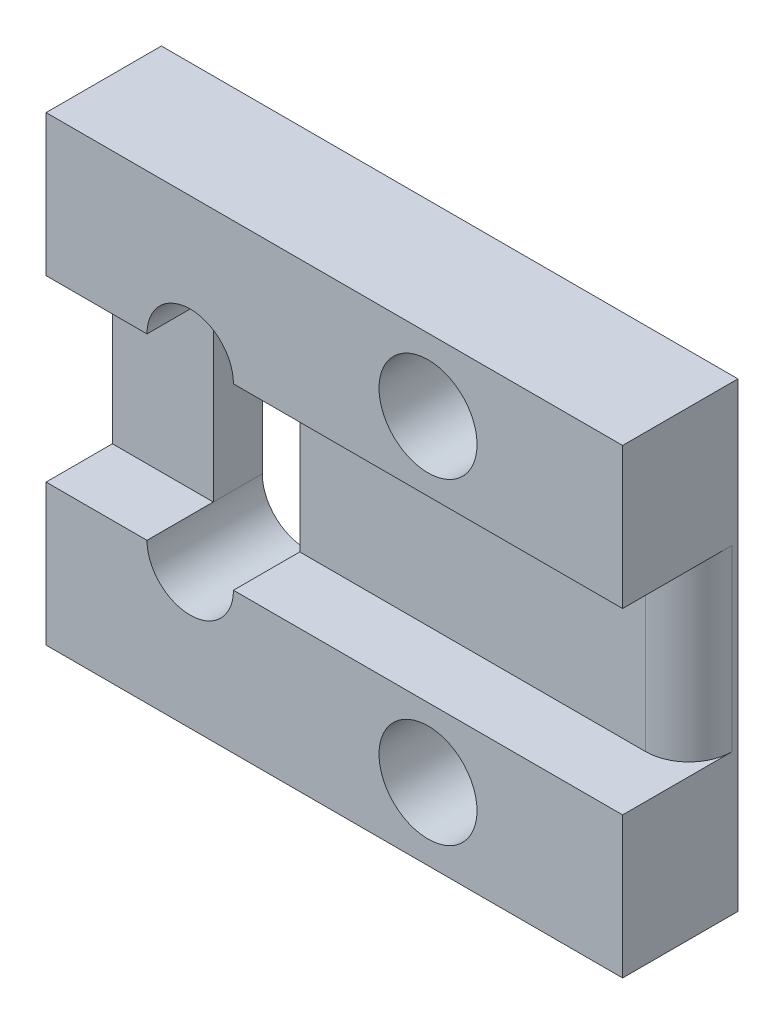
ISO-10303-21;
HEADER;
FILE_DESCRIPTION(('STEP AP214'),'2;1');
FILE_NAME('part.step','',(''),(''),'','','');
FILE_SCHEMA(('AUTOMOTIVE_DESIGN { 1 0 10303 214 1 1 1 1 }'));
ENDSEC;
DATA;
#1=APPLICATION_CONTEXT('core data for automotive mechanical design processes');
#2=APPLICATION_PROTOCOL_DEFINITION('international standard','automotive_design',2000,#1);
#3=PRODUCT_CONTEXT('',#1,'mechanical');
#4=PRODUCT('Part','Part','',(#3));
#5=PRODUCT_RELATED_PRODUCT_CATEGORY('part','',(#4));
#6=PRODUCT_DEFINITION_FORMATION('','',#4);
#7=PRODUCT_DEFINITION_CONTEXT('part definition',#1,'design');
#8=PRODUCT_DEFINITION('design','',#6,#7);
#9=PRODUCT_DEFINITION_SHAPE('','',#8);
#10=(LENGTH_UNIT() NAMED_UNIT(*) SI_UNIT(.MILLI.,.METRE.));
#11=(NAMED_UNIT(*) PLANE_ANGLE_UNIT() SI_UNIT($,.RADIAN.));
#12=(NAMED_UNIT(*) SI_UNIT($,.STERADIAN.) SOLID_ANGLE_UNIT());
#13=UNCERTAINTY_MEASURE_WITH_UNIT(LENGTH_MEASURE(1.E-05),#10,'distance_accuracy_value','');
#14=(GEOMETRIC_REPRESENTATION_CONTEXT(3) GLOBAL_UNCERTAINTY_ASSIGNED_CONTEXT((#13)) GLOBAL_UNIT_ASSIGNED_CONTEXT((#10,
#11,#12)) REPRESENTATION_CONTEXT('',''));
#15=CARTESIAN_POINT('',(0.,0.,0.));
#16=DIRECTION('',(0.,0.,1.));
#17=DIRECTION('',(1.,0.,0.));
#18=AXIS2_PLACEMENT_3D('',#15,#16,#17);
#19=CARTESIAN_POINT('',(0.,16.,4.));
#20=DIRECTION('',(0.,0.,-1.));
#21=DIRECTION('',(-1.,0.,0.));
#22=AXIS2_PLACEMENT_3D('',#19,#20,#21);
#23=PLANE('',#22);
#24=CARTESIAN_POINT('',(13.25,13.5,4.));
#25=DIRECTION('',(0.,0.,1.));
#26=DIRECTION('',(1.,0.,0.));
#27=AXIS2_PLACEMENT_3D('',#24,#25,#26);
#28=CIRCLE('',#27,1.7);
#29=CARTESIAN_POINT('',(14.95,13.5,4.));
#30=VERTEX_POINT('',#29);
#31=EDGE_CURVE('E257',#30,#30,#28,.T.);
#32=ORIENTED_EDGE('',*,*,#31,.F.);
#33=EDGE_LOOP('',(#32));
#34=FACE_BOUND('',#33,.T.);
#35=DIRECTION('',(0.,-1.,0.));
#36=VECTOR('',#35,1.);
#37=CARTESIAN_POINT('',(0.,0.,4.));
#38=LINE('',#37,#36);
#39=CARTESIAN_POINT('',(0.,16.,4.));
#40=VERTEX_POINT('',#39);
#41=CARTESIAN_POINT('',(0.,11.1,4.));
#42=VERTEX_POINT('',#41);
#43=EDGE_CURVE('E168',#40,#42,#38,.T.);
#44=ORIENTED_EDGE('',*,*,#43,.T.);
#45=DIRECTION('',(-1.,0.,0.));
#46=VECTOR('',#45,1.);
#47=CARTESIAN_POINT('',(-1.27364380183259,11.1,4.));
#48=LINE('',#47,#46);
#49=CARTESIAN_POINT('',(3.5,11.1,4.));
#50=VERTEX_POINT('',#49);
#51=EDGE_CURVE('E160',#50,#42,#48,.T.);
#52=ORIENTED_EDGE('',*,*,#51,.F.);
#53=CARTESIAN_POINT('',(5.,11.1,4.));
#54=DIRECTION('',(0.,0.,1.));
#55=DIRECTION('',(1.,0.,0.));
#56=AXIS2_PLACEMENT_3D('',#53,#54,#55);
#57=CIRCLE('',#56,1.5);
#58=CARTESIAN_POINT('',(6.5,11.1,4.));
#59=VERTEX_POINT('',#58);
#60=EDGE_CURVE('E243',#59,#50,#57,.T.);
#61=ORIENTED_EDGE('',*,*,#60,.F.);
#62=CARTESIAN_POINT('',(20.,11.1,4.));
#63=VERTEX_POINT('',#62);
#64=EDGE_CURVE('E242',#63,#59,#48,.T.);
#65=ORIENTED_EDGE('',*,*,#64,.F.);
#66=DIRECTION('',(0.,1.,0.));
#67=VECTOR('',#66,1.);
#68=CARTESIAN_POINT('',(20.,0.,4.));
#69=LINE('',#68,#67);
#70=CARTESIAN_POINT('',(20.,16.,4.));
#71=VERTEX_POINT('',#70);
#72=EDGE_CURVE('E180',#63,#71,#69,.T.);
#73=ORIENTED_EDGE('',*,*,#72,.T.);
#74=DIRECTION('',(-1.,0.,0.));
#75=VECTOR('',#74,1.);
#76=CARTESIAN_POINT('',(0.,16.,4.));
#77=LINE('',#76,#75);
#78=EDGE_CURVE('E183',#71,#40,#77,.T.);
#79=ORIENTED_EDGE('',*,*,#78,.T.);
#80=EDGE_LOOP('',(#44,#52,#61,#65,#73,#79));
#81=FACE_BOUND('',#80,.T.);
#82=ADVANCED_FACE('F33',(#34,#81),#23,.F.);
#83=CARTESIAN_POINT('',(3.5,11.1,4.));
#84=DIRECTION('',(1.,0.,0.));
#85=DIRECTION('',(0.,1.,0.));
#86=AXIS2_PLACEMENT_3D('',#83,#84,#85);
#87=PLANE('',#86);
#88=DIRECTION('',(0.,0.,-1.));
#89=VECTOR('',#88,1.);
#90=CARTESIAN_POINT('',(3.5,11.1,4.));
#91=LINE('',#90,#89);
#92=CARTESIAN_POINT('',(3.5,11.1,1.7));
#93=VERTEX_POINT('',#92);
#94=CARTESIAN_POINT('',(3.5,11.1,0.));
#95=VERTEX_POINT('',#94);
#96=EDGE_CURVE('E291',#93,#95,#91,.T.);
#97=ORIENTED_EDGE('',*,*,#96,.F.);
#98=DIRECTION('',(0.,-1.,0.));
#99=VECTOR('',#98,1.);
#100=CARTESIAN_POINT('',(3.5,11.1,1.7));
#101=LINE('',#100,#99);
#102=CARTESIAN_POINT('',(3.5,4.9,1.7));
#103=VERTEX_POINT('',#102);
#104=EDGE_CURVE('E251',#93,#103,#101,.T.);
#105=ORIENTED_EDGE('',*,*,#104,.T.);
#106=DIRECTION('',(0.,0.,-1.));
#107=VECTOR('',#106,1.);
#108=CARTESIAN_POINT('',(3.5,4.9,4.));
#109=LINE('',#108,#107);
#110=CARTESIAN_POINT('',(3.5,4.9,0.));
#111=VERTEX_POINT('',#110);
#112=EDGE_CURVE('E289',#103,#111,#109,.T.);
#113=ORIENTED_EDGE('',*,*,#112,.T.);
#114=DIRECTION('',(0.,-1.,0.));
#115=VECTOR('',#114,1.);
#116=CARTESIAN_POINT('',(3.5,11.1,0.));
#117=LINE('',#116,#115);
#118=EDGE_CURVE('E276',#95,#111,#117,.T.);
#119=ORIENTED_EDGE('',*,*,#118,.F.);
#120=EDGE_LOOP('',(#97,#105,#113,#119));
#121=FACE_BOUND('',#120,.T.);
#122=ADVANCED_FACE('F297',(#121),#87,.T.);
#123=CARTESIAN_POINT('',(6.5,11.1,4.));
#124=DIRECTION('',(-1.,0.,0.));
#125=DIRECTION('',(0.,-1.,0.));
#126=AXIS2_PLACEMENT_3D('',#123,#124,#125);
#127=PLANE('',#126);
#128=DIRECTION('',(0.,0.,-1.));
#129=VECTOR('',#128,1.);
#130=CARTESIAN_POINT('',(6.5,4.9,4.));
#131=LINE('',#130,#129);
#132=CARTESIAN_POINT('',(6.5,4.9,1.7));
#133=VERTEX_POINT('',#132);
#134=CARTESIAN_POINT('',(6.5,4.9,0.));
#135=VERTEX_POINT('',#134);
#136=EDGE_CURVE('E286',#133,#135,#131,.T.);
#137=ORIENTED_EDGE('',*,*,#136,.F.);
#138=DIRECTION('',(0.,1.,0.));
#139=VECTOR('',#138,1.);
#140=CARTESIAN_POINT('',(6.5,11.1,1.7));
#141=LINE('',#140,#139);
#142=CARTESIAN_POINT('',(6.5,11.1,1.7));
#143=VERTEX_POINT('',#142);
#144=EDGE_CURVE('E200',#133,#143,#141,.T.);
#145=ORIENTED_EDGE('',*,*,#144,.T.);
#146=DIRECTION('',(0.,0.,-1.));
#147=VECTOR('',#146,1.);
#148=CARTESIAN_POINT('',(6.5,11.1,4.));
#149=LINE('',#148,#147);
#150=CARTESIAN_POINT('',(6.5,11.1,0.));
#151=VERTEX_POINT('',#150);
#152=EDGE_CURVE('E273',#143,#151,#149,.T.);
#153=ORIENTED_EDGE('',*,*,#152,.T.);
#154=DIRECTION('',(0.,1.,0.));
#155=VECTOR('',#154,1.);
#156=CARTESIAN_POINT('',(6.5,11.1,0.));
#157=LINE('',#156,#155);
#158=EDGE_CURVE('E271',#135,#151,#157,.T.);
#159=ORIENTED_EDGE('',*,*,#158,.F.);
#160=EDGE_LOOP('',(#137,#145,#153,#159));
#161=FACE_BOUND('',#160,.T.);
#162=ADVANCED_FACE('F334',(#161),#127,.T.);
#163=CARTESIAN_POINT('',(0.,16.,0.));
#164=DIRECTION('',(0.,0.,-1.));
#165=DIRECTION('',(-1.,0.,0.));
#166=AXIS2_PLACEMENT_3D('',#163,#164,#165);
#167=PLANE('',#166);
#168=CARTESIAN_POINT('',(13.25,2.5,0.));
#169=DIRECTION('',(0.,0.,1.));
#170=DIRECTION('',(1.,0.,0.));
#171=AXIS2_PLACEMENT_3D('',#168,#169,#170);
#172=CIRCLE('',#171,1.7);
#173=CARTESIAN_POINT('',(14.95,2.5,0.));
#174=VERTEX_POINT('',#173);
#175=EDGE_CURVE('E266',#174,#174,#172,.T.);
#176=ORIENTED_EDGE('',*,*,#175,.T.);
#177=EDGE_LOOP('',(#176));
#178=FACE_BOUND('',#177,.T.);
#179=DIRECTION('',(0.,-1.,0.));
#180=VECTOR('',#179,1.);
#181=CARTESIAN_POINT('',(0.,0.,0.));
#182=LINE('',#181,#180);
#183=CARTESIAN_POINT('',(0.,16.,0.));
#184=VERTEX_POINT('',#183);
#185=CARTESIAN_POINT('',(0.,0.,0.));
#186=VERTEX_POINT('',#185);
#187=EDGE_CURVE('E186',#184,#186,#182,.T.);
#188=ORIENTED_EDGE('',*,*,#187,.F.);
#189=DIRECTION('',(-1.,0.,0.));
#190=VECTOR('',#189,1.);
#191=CARTESIAN_POINT('',(0.,16.,0.));
#192=LINE('',#191,#190);
#193=CARTESIAN_POINT('',(20.,16.,0.));
#194=VERTEX_POINT('',#193);
#195=EDGE_CURVE('E169',#194,#184,#192,.T.);
#196=ORIENTED_EDGE('',*,*,#195,.F.);
#197=DIRECTION('',(0.,1.,0.));
#198=VECTOR('',#197,1.);
#199=CARTESIAN_POINT('',(20.,0.,0.));
#200=LINE('',#199,#198);
#201=CARTESIAN_POINT('',(20.,0.,0.));
#202=VERTEX_POINT('',#201);
#203=EDGE_CURVE('E173',#202,#194,#200,.T.);
#204=ORIENTED_EDGE('',*,*,#203,.F.);
#205=DIRECTION('',(1.,0.,0.));
#206=VECTOR('',#205,1.);
#207=CARTESIAN_POINT('',(0.,0.,0.));
#208=LINE('',#207,#206);
#209=EDGE_CURVE('E188',#186,#202,#208,.T.);
#210=ORIENTED_EDGE('',*,*,#209,.F.);
#211=EDGE_LOOP('',(#188,#196,#204,#210));
#212=FACE_BOUND('',#211,.T.);
#213=ORIENTED_EDGE('',*,*,#158,.T.);
#214=CARTESIAN_POINT('',(5.,11.1,0.));
#215=DIRECTION('',(0.,0.,1.));
#216=DIRECTION('',(1.,0.,0.));
#217=AXIS2_PLACEMENT_3D('',#214,#215,#216);
#218=CIRCLE('',#217,1.5);
#219=EDGE_CURVE('E269',#151,#95,#218,.T.);
#220=ORIENTED_EDGE('',*,*,#219,.T.);
#221=ORIENTED_EDGE('',*,*,#118,.T.);
#222=CARTESIAN_POINT('',(5.,4.9,0.));
#223=DIRECTION('',(0.,0.,1.));
#224=DIRECTION('',(1.,0.,0.));
#225=AXIS2_PLACEMENT_3D('',#222,#223,#224);
#226=CIRCLE('',#225,1.5);
#227=EDGE_CURVE('E279',#111,#135,#226,.T.);
#228=ORIENTED_EDGE('',*,*,#227,.T.);
#229=EDGE_LOOP('',(#213,#220,#221,#228));
#230=FACE_BOUND('',#229,.T.);
#231=CARTESIAN_POINT('',(13.25,13.5,0.));
#232=DIRECTION('',(0.,0.,1.));
#233=DIRECTION('',(1.,0.,0.));
#234=AXIS2_PLACEMENT_3D('',#231,#232,#233);
#235=CIRCLE('',#234,1.7);
#236=CARTESIAN_POINT('',(14.95,13.5,0.));
#237=VERTEX_POINT('',#236);
#238=EDGE_CURVE('E260',#237,#237,#235,.T.);
#239=ORIENTED_EDGE('',*,*,#238,.T.);
#240=EDGE_LOOP('',(#239));
#241=FACE_BOUND('',#240,.T.);
#242=ADVANCED_FACE('F229',(#178,#212,#230,#241),#167,.T.);
#243=CARTESIAN_POINT('',(20.,0.,4.));
#244=VERTEX_POINT('',#243);
#245=CARTESIAN_POINT('',(20.,4.9,4.));
#246=VERTEX_POINT('',#245);
#247=EDGE_CURVE('E181',#244,#246,#69,.T.);
#248=ORIENTED_EDGE('',*,*,#247,.T.);
#249=DIRECTION('',(1.,0.,0.));
#250=VECTOR('',#249,1.);
#251=CARTESIAN_POINT('',(-1.27364380183259,4.9,4.));
#252=LINE('',#251,#250);
#253=CARTESIAN_POINT('',(6.5,4.9,4.));
#254=VERTEX_POINT('',#253);
#255=EDGE_CURVE('E161',#254,#246,#252,.T.);
#256=ORIENTED_EDGE('',*,*,#255,.F.);
#257=CARTESIAN_POINT('',(5.,4.9,4.));
#258=DIRECTION('',(0.,0.,1.));
#259=DIRECTION('',(1.,0.,0.));
#260=AXIS2_PLACEMENT_3D('',#257,#258,#259);
#261=CIRCLE('',#260,1.5);
#262=CARTESIAN_POINT('',(3.5,4.9,4.));
#263=VERTEX_POINT('',#262);
#264=EDGE_CURVE('E159',#263,#254,#261,.T.);
#265=ORIENTED_EDGE('',*,*,#264,.F.);
#266=CARTESIAN_POINT('',(0.,4.9,4.));
#267=VERTEX_POINT('',#266);
#268=EDGE_CURVE('E142',#267,#263,#252,.T.);
#269=ORIENTED_EDGE('',*,*,#268,.F.);
#270=CARTESIAN_POINT('',(0.,0.,4.));
#271=VERTEX_POINT('',#270);
#272=EDGE_CURVE('E155',#267,#271,#38,.T.);
#273=ORIENTED_EDGE('',*,*,#272,.T.);
#274=DIRECTION('',(1.,0.,0.));
#275=VECTOR('',#274,1.);
#276=CARTESIAN_POINT('',(0.,0.,4.));
#277=LINE('',#276,#275);
#278=EDGE_CURVE('E172',#271,#244,#277,.T.);
#279=ORIENTED_EDGE('',*,*,#278,.T.);
#280=EDGE_LOOP('',(#248,#256,#265,#269,#273,#279));
#281=FACE_BOUND('',#280,.T.);
#282=CARTESIAN_POINT('',(13.25,2.5,4.));
#283=DIRECTION('',(0.,0.,1.));
#284=DIRECTION('',(1.,0.,0.));
#285=AXIS2_PLACEMENT_3D('',#282,#283,#284);
#286=CIRCLE('',#285,1.7);
#287=CARTESIAN_POINT('',(14.95,2.5,4.));
#288=VERTEX_POINT('',#287);
#289=EDGE_CURVE('E263',#288,#288,#286,.T.);
#290=ORIENTED_EDGE('',*,*,#289,.F.);
#291=EDGE_LOOP('',(#290));
#292=FACE_BOUND('',#291,.T.);
#293=ADVANCED_FACE('F153',(#281,#292),#23,.F.);
#294=CARTESIAN_POINT('',(0.,0.,4.));
#295=DIRECTION('',(1.,0.,0.));
#296=DIRECTION('',(0.,1.,0.));
#297=AXIS2_PLACEMENT_3D('',#294,#295,#296);
#298=PLANE('',#297);
#299=DIRECTION('',(0.,-1.,0.));
#300=VECTOR('',#299,1.);
#301=CARTESIAN_POINT('',(0.,0.,1.7));
#302=LINE('',#301,#300);
#303=CARTESIAN_POINT('',(0.,11.1,1.7));
#304=VERTEX_POINT('',#303);
#305=CARTESIAN_POINT('',(0.,4.9,1.7));
#306=VERTEX_POINT('',#305);
#307=EDGE_CURVE('E219',#304,#306,#302,.T.);
#308=ORIENTED_EDGE('',*,*,#307,.F.);
#309=DIRECTION('',(0.,0.,1.));
#310=VECTOR('',#309,1.);
#311=CARTESIAN_POINT('',(0.,11.1,4.));
#312=LINE('',#311,#310);
#313=EDGE_CURVE('E237',#304,#42,#312,.T.);
#314=ORIENTED_EDGE('',*,*,#313,.T.);
#315=ORIENTED_EDGE('',*,*,#43,.F.);
#316=DIRECTION('',(0.,0.,-1.));
#317=VECTOR('',#316,1.);
#318=CARTESIAN_POINT('',(0.,16.,4.));
#319=LINE('',#318,#317);
#320=EDGE_CURVE('E185',#40,#184,#319,.T.);
#321=ORIENTED_EDGE('',*,*,#320,.T.);
#322=ORIENTED_EDGE('',*,*,#187,.T.);
#323=DIRECTION('',(0.,0.,-1.));
#324=VECTOR('',#323,1.);
#325=CARTESIAN_POINT('',(0.,0.,4.));
#326=LINE('',#325,#324);
#327=EDGE_CURVE('E167',#271,#186,#326,.T.);
#328=ORIENTED_EDGE('',*,*,#327,.F.);
#329=ORIENTED_EDGE('',*,*,#272,.F.);
#330=DIRECTION('',(0.,0.,-1.));
#331=VECTOR('',#330,1.);
#332=CARTESIAN_POINT('',(0.,4.9,4.));
#333=LINE('',#332,#331);
#334=EDGE_CURVE('E139',#267,#306,#333,.T.);
#335=ORIENTED_EDGE('',*,*,#334,.T.);
#336=EDGE_LOOP('',(#308,#314,#315,#321,#322,#328,#329,#335));
#337=FACE_BOUND('',#336,.T.);
#338=ADVANCED_FACE('F164',(#337),#298,.F.);
#339=CARTESIAN_POINT('',(0.,0.,4.));
#340=DIRECTION('',(0.,1.,0.));
#341=DIRECTION('',(-1.,0.,0.));
#342=AXIS2_PLACEMENT_3D('',#339,#340,#341);
#343=PLANE('',#342);
#344=ORIENTED_EDGE('',*,*,#209,.T.);
#345=DIRECTION('',(0.,0.,-1.));
#346=VECTOR('',#345,1.);
#347=CARTESIAN_POINT('',(20.,0.,4.));
#348=LINE('',#347,#346);
#349=EDGE_CURVE('E196',#244,#202,#348,.T.);
#350=ORIENTED_EDGE('',*,*,#349,.F.);
#351=ORIENTED_EDGE('',*,*,#278,.F.);
#352=ORIENTED_EDGE('',*,*,#327,.T.);
#353=EDGE_LOOP('',(#344,#350,#351,#352));
#354=FACE_BOUND('',#353,.T.);
#355=ADVANCED_FACE('F223',(#354),#343,.F.);
#356=CARTESIAN_POINT('',(20.,0.,4.));
#357=DIRECTION('',(-1.,0.,0.));
#358=DIRECTION('',(0.,-1.,0.));
#359=AXIS2_PLACEMENT_3D('',#356,#357,#358);
#360=PLANE('',#359);
#361=DIRECTION('',(0.,0.,-1.));
#362=VECTOR('',#361,1.);
#363=CARTESIAN_POINT('',(20.,11.1,4.));
#364=LINE('',#363,#362);
#365=CARTESIAN_POINT('',(20.,11.1,0.2));
#366=VERTEX_POINT('',#365);
#367=EDGE_CURVE('E48',#63,#366,#364,.T.);
#368=ORIENTED_EDGE('',*,*,#367,.T.);
#369=DIRECTION('',(0.,1.,0.));
#370=VECTOR('',#369,1.);
#371=CARTESIAN_POINT('',(20.,4.9,0.2));
#372=LINE('',#371,#370);
#373=CARTESIAN_POINT('',(20.,4.9,0.2));
#374=VERTEX_POINT('',#373);
#375=EDGE_CURVE('E206',#366,#374,#372,.F.);
#376=ORIENTED_EDGE('',*,*,#375,.T.);
#377=DIRECTION('',(0.,0.,1.));
#378=VECTOR('',#377,1.);
#379=CARTESIAN_POINT('',(20.,4.9,4.));
#380=LINE('',#379,#378);
#381=EDGE_CURVE('E55',#374,#246,#380,.T.);
#382=ORIENTED_EDGE('',*,*,#381,.T.);
#383=ORIENTED_EDGE('',*,*,#247,.F.);
#384=ORIENTED_EDGE('',*,*,#349,.T.);
#385=ORIENTED_EDGE('',*,*,#203,.T.);
#386=DIRECTION('',(0.,0.,-1.));
#387=VECTOR('',#386,1.);
#388=CARTESIAN_POINT('',(20.,16.,4.));
#389=LINE('',#388,#387);
#390=EDGE_CURVE('E193',#71,#194,#389,.T.);
#391=ORIENTED_EDGE('',*,*,#390,.F.);
#392=ORIENTED_EDGE('',*,*,#72,.F.);
#393=EDGE_LOOP('',(#368,#376,#382,#383,#384,#385,#391,#392));
#394=FACE_BOUND('',#393,.T.);
#395=ADVANCED_FACE('F217',(#394),#360,.F.);
#396=CARTESIAN_POINT('',(0.,16.,4.));
#397=DIRECTION('',(0.,-1.,0.));
#398=DIRECTION('',(1.,0.,0.));
#399=AXIS2_PLACEMENT_3D('',#396,#397,#398);
#400=PLANE('',#399);
#401=ORIENTED_EDGE('',*,*,#195,.T.);
#402=ORIENTED_EDGE('',*,*,#320,.F.);
#403=ORIENTED_EDGE('',*,*,#78,.F.);
#404=ORIENTED_EDGE('',*,*,#390,.T.);
#405=EDGE_LOOP('',(#401,#402,#403,#404));
#406=FACE_BOUND('',#405,.T.);
#407=ADVANCED_FACE('F233',(#406),#400,.F.);
#408=CARTESIAN_POINT('',(5.,11.1,4.));
#409=DIRECTION('',(0.,0.,-1.));
#410=DIRECTION('',(-1.,0.,0.));
#411=AXIS2_PLACEMENT_3D('',#408,#409,#410);
#412=CYLINDRICAL_SURFACE('',#411,1.5);
#413=ORIENTED_EDGE('',*,*,#219,.F.);
#414=ORIENTED_EDGE('',*,*,#152,.F.);
#415=EDGE_CURVE('E284',#59,#143,#149,.T.);
#416=ORIENTED_EDGE('',*,*,#415,.F.);
#417=ORIENTED_EDGE('',*,*,#60,.T.);
#418=EDGE_CURVE('E177',#50,#93,#91,.T.);
#419=ORIENTED_EDGE('',*,*,#418,.T.);
#420=ORIENTED_EDGE('',*,*,#96,.T.);
#421=EDGE_LOOP('',(#413,#414,#416,#417,#419,#420));
#422=FACE_BOUND('',#421,.T.);
#423=ADVANCED_FACE('F306',(#422),#412,.F.);
#424=CARTESIAN_POINT('',(5.,4.9,4.));
#425=DIRECTION('',(0.,0.,-1.));
#426=DIRECTION('',(-1.,0.,0.));
#427=AXIS2_PLACEMENT_3D('',#424,#425,#426);
#428=CYLINDRICAL_SURFACE('',#427,1.5);
#429=ORIENTED_EDGE('',*,*,#227,.F.);
#430=ORIENTED_EDGE('',*,*,#112,.F.);
#431=EDGE_CURVE('E290',#263,#103,#109,.T.);
#432=ORIENTED_EDGE('',*,*,#431,.F.);
#433=ORIENTED_EDGE('',*,*,#264,.T.);
#434=EDGE_CURVE('E287',#254,#133,#131,.T.);
#435=ORIENTED_EDGE('',*,*,#434,.T.);
#436=ORIENTED_EDGE('',*,*,#136,.T.);
#437=EDGE_LOOP('',(#429,#430,#432,#433,#435,#436));
#438=FACE_BOUND('',#437,.T.);
#439=ADVANCED_FACE('F299',(#438),#428,.F.);
#440=CARTESIAN_POINT('',(13.25,2.5,4.));
#441=DIRECTION('',(0.,0.,1.));
#442=DIRECTION('',(1.,0.,0.));
#443=AXIS2_PLACEMENT_3D('',#440,#441,#442);
#444=CYLINDRICAL_SURFACE('',#443,1.7);
#445=ORIENTED_EDGE('',*,*,#175,.F.);
#446=EDGE_LOOP('',(#445));
#447=FACE_BOUND('',#446,.T.);
#448=ORIENTED_EDGE('',*,*,#289,.T.);
#449=EDGE_LOOP('',(#448));
#450=FACE_BOUND('',#449,.T.);
#451=ADVANCED_FACE('F380',(#447,#450),#444,.F.);
#452=CARTESIAN_POINT('',(13.25,13.5,4.));
#453=DIRECTION('',(0.,0.,1.));
#454=DIRECTION('',(1.,0.,0.));
#455=AXIS2_PLACEMENT_3D('',#452,#453,#454);
#456=CYLINDRICAL_SURFACE('',#455,1.7);
#457=ORIENTED_EDGE('',*,*,#238,.F.);
#458=EDGE_LOOP('',(#457));
#459=FACE_BOUND('',#458,.T.);
#460=ORIENTED_EDGE('',*,*,#31,.T.);
#461=EDGE_LOOP('',(#460));
#462=FACE_BOUND('',#461,.T.);
#463=ADVANCED_FACE('F326',(#459,#462),#456,.F.);
#464=CARTESIAN_POINT('',(-1.27364380183259,4.9,1.7));
#465=DIRECTION('',(0.,0.,1.));
#466=DIRECTION('',(1.,0.,0.));
#467=AXIS2_PLACEMENT_3D('',#464,#465,#466);
#468=PLANE('',#467);
#469=DIRECTION('',(1.,0.,0.));
#470=VECTOR('',#469,1.);
#471=CARTESIAN_POINT('',(-1.27364380183259,4.9,1.7));
#472=LINE('',#471,#470);
#473=CARTESIAN_POINT('',(18.5,4.9,1.7));
#474=VERTEX_POINT('',#473);
#475=EDGE_CURVE('E245',#133,#474,#472,.T.);
#476=ORIENTED_EDGE('',*,*,#475,.T.);
#477=DIRECTION('',(0.,1.,0.));
#478=VECTOR('',#477,1.);
#479=CARTESIAN_POINT('',(18.5,11.1,1.7));
#480=LINE('',#479,#478);
#481=CARTESIAN_POINT('',(18.5,11.1,1.7));
#482=VERTEX_POINT('',#481);
#483=EDGE_CURVE('E203',#474,#482,#480,.T.);
#484=ORIENTED_EDGE('',*,*,#483,.T.);
#485=DIRECTION('',(-1.,0.,0.));
#486=VECTOR('',#485,1.);
#487=CARTESIAN_POINT('',(-1.27364380183259,11.1,1.7));
#488=LINE('',#487,#486);
#489=EDGE_CURVE('E213',#482,#143,#488,.T.);
#490=ORIENTED_EDGE('',*,*,#489,.T.);
#491=ORIENTED_EDGE('',*,*,#144,.F.);
#492=EDGE_LOOP('',(#476,#484,#490,#491));
#493=FACE_BOUND('',#492,.T.);
#494=ADVANCED_FACE('F317',(#493),#468,.T.);
#495=CARTESIAN_POINT('',(-1.27364380183259,4.9,1.7));
#496=DIRECTION('',(0.,-1.,0.));
#497=DIRECTION('',(0.,0.,-1.));
#498=AXIS2_PLACEMENT_3D('',#495,#496,#497);
#499=PLANE('',#498);
#500=ORIENTED_EDGE('',*,*,#475,.F.);
#501=ORIENTED_EDGE('',*,*,#434,.F.);
#502=ORIENTED_EDGE('',*,*,#255,.T.);
#503=ORIENTED_EDGE('',*,*,#381,.F.);
#504=CARTESIAN_POINT('',(18.5,4.9,0.2));
#505=DIRECTION('',(0.,-1.,0.));
#506=DIRECTION('',(0.,0.,-1.));
#507=AXIS2_PLACEMENT_3D('',#504,#505,#506);
#508=CIRCLE('',#507,1.5);
#509=EDGE_CURVE('E11',#374,#474,#508,.T.);
#510=ORIENTED_EDGE('',*,*,#509,.T.);
#511=EDGE_LOOP('',(#500,#501,#502,#503,#510));
#512=FACE_BOUND('',#511,.T.);
#513=ADVANCED_FACE('F323',(#512),#499,.F.);
#514=CARTESIAN_POINT('',(-1.27364380183259,11.1,1.7));
#515=DIRECTION('',(0.,1.,0.));
#516=DIRECTION('',(-1.,0.,0.));
#517=AXIS2_PLACEMENT_3D('',#514,#515,#516);
#518=PLANE('',#517);
#519=ORIENTED_EDGE('',*,*,#64,.T.);
#520=ORIENTED_EDGE('',*,*,#415,.T.);
#521=ORIENTED_EDGE('',*,*,#489,.F.);
#522=CARTESIAN_POINT('',(18.5,11.1,0.2));
#523=DIRECTION('',(0.,1.,0.));
#524=DIRECTION('',(-1.,0.,0.));
#525=AXIS2_PLACEMENT_3D('',#522,#523,#524);
#526=CIRCLE('',#525,1.5);
#527=EDGE_CURVE('E41',#482,#366,#526,.T.);
#528=ORIENTED_EDGE('',*,*,#527,.T.);
#529=ORIENTED_EDGE('',*,*,#367,.F.);
#530=EDGE_LOOP('',(#519,#520,#521,#528,#529));
#531=FACE_BOUND('',#530,.T.);
#532=ADVANCED_FACE('F210',(#531),#518,.F.);
#533=EDGE_CURVE('E312',#93,#304,#488,.T.);
#534=ORIENTED_EDGE('',*,*,#533,.F.);
#535=ORIENTED_EDGE('',*,*,#418,.F.);
#536=ORIENTED_EDGE('',*,*,#51,.T.);
#537=ORIENTED_EDGE('',*,*,#313,.F.);
#538=EDGE_LOOP('',(#534,#535,#536,#537));
#539=FACE_BOUND('',#538,.T.);
#540=ADVANCED_FACE('F310',(#539),#518,.F.);
#541=ORIENTED_EDGE('',*,*,#268,.T.);
#542=ORIENTED_EDGE('',*,*,#431,.T.);
#543=EDGE_CURVE('E145',#306,#103,#472,.T.);
#544=ORIENTED_EDGE('',*,*,#543,.F.);
#545=ORIENTED_EDGE('',*,*,#334,.F.);
#546=EDGE_LOOP('',(#541,#542,#544,#545));
#547=FACE_BOUND('',#546,.T.);
#548=ADVANCED_FACE('F141',(#547),#499,.F.);
#549=ORIENTED_EDGE('',*,*,#307,.T.);
#550=ORIENTED_EDGE('',*,*,#543,.T.);
#551=ORIENTED_EDGE('',*,*,#104,.F.);
#552=ORIENTED_EDGE('',*,*,#533,.T.);
#553=EDGE_LOOP('',(#549,#550,#551,#552));
#554=FACE_BOUND('',#553,.T.);
#555=ADVANCED_FACE('F314',(#554),#468,.T.);
#556=CARTESIAN_POINT('',(18.5,4.90000000000001,0.2));
#557=DIRECTION('',(0.,-1.,0.));
#558=DIRECTION('',(1.,0.,0.));
#559=AXIS2_PLACEMENT_3D('',#556,#557,#558);
#560=CYLINDRICAL_SURFACE('',#559,1.5);
#561=ORIENTED_EDGE('',*,*,#509,.F.);
#562=ORIENTED_EDGE('',*,*,#375,.F.);
#563=ORIENTED_EDGE('',*,*,#527,.F.);
#564=ORIENTED_EDGE('',*,*,#483,.F.);
#565=EDGE_LOOP('',(#561,#562,#563,#564));
#566=FACE_BOUND('',#565,.T.);
#567=ADVANCED_FACE('F35',(#566),#560,.T.);
#568=CLOSED_SHELL('',(#82,#122,#162,#242,#293,#338,#355,#395,#407,#423,#439,#451,#463,#494,#513,
#532,#540,#548,#555,#567));
#569=MANIFOLD_SOLID_BREP('B2',#568);
#570=ADVANCED_BREP_SHAPE_REPRESENTATION('',(#18,#569),#14);
#571=SHAPE_DEFINITION_REPRESENTATION(#9,#570);
ENDSEC;
END-ISO-10303-21;
